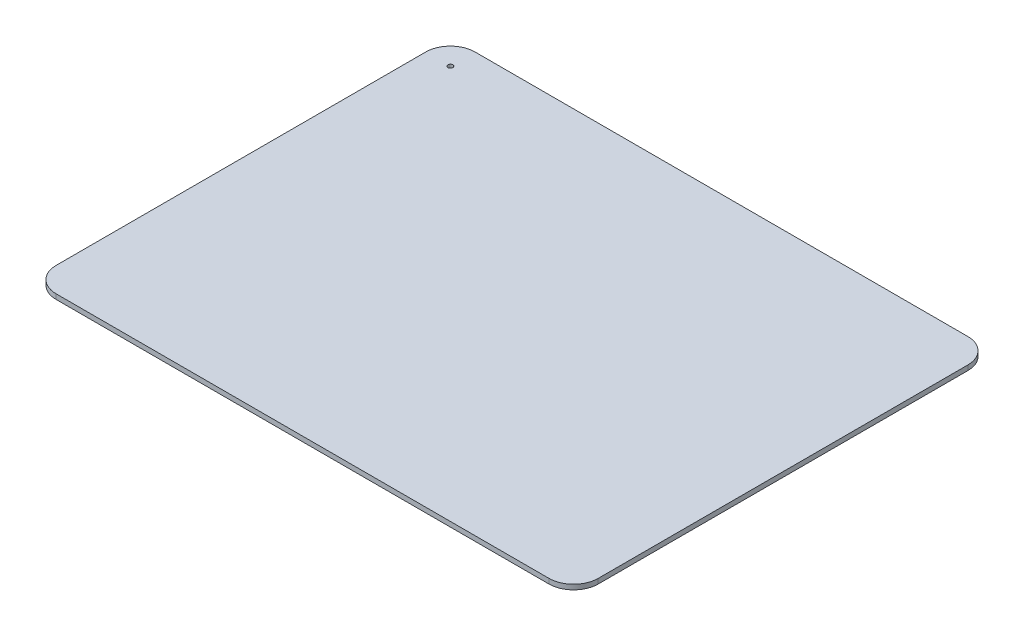
ISO-10303-21;
HEADER;
FILE_DESCRIPTION(('STEP AP214'),'2;1');
FILE_NAME('part.step','',(''),(''),'','','');
FILE_SCHEMA(('AUTOMOTIVE_DESIGN { 1 0 10303 214 1 1 1 1 }'));
ENDSEC;
DATA;
#1=APPLICATION_CONTEXT('core data for automotive mechanical design processes');
#2=APPLICATION_PROTOCOL_DEFINITION('international standard','automotive_design',2000,#1);
#3=PRODUCT_CONTEXT('',#1,'mechanical');
#4=PRODUCT('Part','Part','',(#3));
#5=PRODUCT_RELATED_PRODUCT_CATEGORY('part','',(#4));
#6=PRODUCT_DEFINITION_FORMATION('','',#4);
#7=PRODUCT_DEFINITION_CONTEXT('part definition',#1,'design');
#8=PRODUCT_DEFINITION('design','',#6,#7);
#9=PRODUCT_DEFINITION_SHAPE('','',#8);
#10=(LENGTH_UNIT() NAMED_UNIT(*) SI_UNIT(.MILLI.,.METRE.));
#11=(NAMED_UNIT(*) PLANE_ANGLE_UNIT() SI_UNIT($,.RADIAN.));
#12=(NAMED_UNIT(*) SI_UNIT($,.STERADIAN.) SOLID_ANGLE_UNIT());
#13=UNCERTAINTY_MEASURE_WITH_UNIT(LENGTH_MEASURE(1.E-05),#10,'distance_accuracy_value','');
#14=(GEOMETRIC_REPRESENTATION_CONTEXT(3) GLOBAL_UNCERTAINTY_ASSIGNED_CONTEXT((#13)) GLOBAL_UNIT_ASSIGNED_CONTEXT((#10,
#11,#12)) REPRESENTATION_CONTEXT('',''));
#15=CARTESIAN_POINT('',(0.,0.,0.));
#16=DIRECTION('',(0.,0.,1.));
#17=DIRECTION('',(1.,0.,0.));
#18=AXIS2_PLACEMENT_3D('',#15,#16,#17);
#19=CARTESIAN_POINT('',(500.,10.,375.));
#20=DIRECTION('',(0.,-1.,0.));
#21=DIRECTION('',(0.,0.,-1.));
#22=AXIS2_PLACEMENT_3D('',#19,#20,#21);
#23=CYLINDRICAL_SURFACE('',#22,50.);
#24=CARTESIAN_POINT('',(500.,0.,375.));
#25=DIRECTION('',(0.,1.,0.));
#26=DIRECTION('',(0.,0.,1.));
#27=AXIS2_PLACEMENT_3D('',#24,#25,#26);
#28=CIRCLE('',#27,50.);
#29=CARTESIAN_POINT('',(500.,0.,425.));
#30=VERTEX_POINT('',#29);
#31=CARTESIAN_POINT('',(550.,0.,375.));
#32=VERTEX_POINT('',#31);
#33=EDGE_CURVE('E134',#30,#32,#28,.T.);
#34=ORIENTED_EDGE('',*,*,#33,.T.);
#35=DIRECTION('',(0.,-1.,0.));
#36=VECTOR('',#35,1.);
#37=CARTESIAN_POINT('',(550.,10.,375.));
#38=LINE('',#37,#36);
#39=CARTESIAN_POINT('',(550.,10.,375.));
#40=VERTEX_POINT('',#39);
#41=EDGE_CURVE('E11',#40,#32,#38,.T.);
#42=ORIENTED_EDGE('',*,*,#41,.F.);
#43=CARTESIAN_POINT('',(500.,10.,375.));
#44=DIRECTION('',(0.,1.,0.));
#45=DIRECTION('',(0.,0.,1.));
#46=AXIS2_PLACEMENT_3D('',#43,#44,#45);
#47=CIRCLE('',#46,50.);
#48=CARTESIAN_POINT('',(500.,10.,425.));
#49=VERTEX_POINT('',#48);
#50=EDGE_CURVE('E148',#49,#40,#47,.T.);
#51=ORIENTED_EDGE('',*,*,#50,.F.);
#52=DIRECTION('',(0.,-1.,0.));
#53=VECTOR('',#52,1.);
#54=CARTESIAN_POINT('',(500.,10.,425.));
#55=LINE('',#54,#53);
#56=EDGE_CURVE('E130',#49,#30,#55,.T.);
#57=ORIENTED_EDGE('',*,*,#56,.T.);
#58=EDGE_LOOP('',(#34,#42,#51,#57));
#59=FACE_BOUND('',#58,.T.);
#60=ADVANCED_FACE('F37',(#59),#23,.T.);
#61=CARTESIAN_POINT('',(550.,10.,375.));
#62=DIRECTION('',(-1.,0.,0.));
#63=DIRECTION('',(0.,0.,1.));
#64=AXIS2_PLACEMENT_3D('',#61,#62,#63);
#65=PLANE('',#64);
#66=DIRECTION('',(0.,0.,-1.));
#67=VECTOR('',#66,1.);
#68=CARTESIAN_POINT('',(550.,0.,375.));
#69=LINE('',#68,#67);
#70=CARTESIAN_POINT('',(550.,0.,-375.));
#71=VERTEX_POINT('',#70);
#72=EDGE_CURVE('E137',#32,#71,#69,.T.);
#73=ORIENTED_EDGE('',*,*,#72,.T.);
#74=DIRECTION('',(0.,-1.,0.));
#75=VECTOR('',#74,1.);
#76=CARTESIAN_POINT('',(550.,10.,-375.));
#77=LINE('',#76,#75);
#78=CARTESIAN_POINT('',(550.,10.,-375.));
#79=VERTEX_POINT('',#78);
#80=EDGE_CURVE('E46',#79,#71,#77,.T.);
#81=ORIENTED_EDGE('',*,*,#80,.F.);
#82=DIRECTION('',(0.,0.,-1.));
#83=VECTOR('',#82,1.);
#84=CARTESIAN_POINT('',(550.,10.,375.));
#85=LINE('',#84,#83);
#86=EDGE_CURVE('E97',#40,#79,#85,.T.);
#87=ORIENTED_EDGE('',*,*,#86,.F.);
#88=ORIENTED_EDGE('',*,*,#41,.T.);
#89=EDGE_LOOP('',(#73,#81,#87,#88));
#90=FACE_BOUND('',#89,.T.);
#91=ADVANCED_FACE('F200',(#90),#65,.F.);
#92=CARTESIAN_POINT('',(500.,10.,-375.));
#93=DIRECTION('',(0.,-1.,0.));
#94=DIRECTION('',(0.,0.,-1.));
#95=AXIS2_PLACEMENT_3D('',#92,#93,#94);
#96=CYLINDRICAL_SURFACE('',#95,50.);
#97=CARTESIAN_POINT('',(500.,0.,-375.));
#98=DIRECTION('',(0.,1.,0.));
#99=DIRECTION('',(0.,0.,-1.));
#100=AXIS2_PLACEMENT_3D('',#97,#98,#99);
#101=CIRCLE('',#100,50.);
#102=CARTESIAN_POINT('',(500.,0.,-425.));
#103=VERTEX_POINT('',#102);
#104=EDGE_CURVE('E139',#71,#103,#101,.T.);
#105=ORIENTED_EDGE('',*,*,#104,.T.);
#106=DIRECTION('',(0.,-1.,0.));
#107=VECTOR('',#106,1.);
#108=CARTESIAN_POINT('',(500.,10.,-425.));
#109=LINE('',#108,#107);
#110=CARTESIAN_POINT('',(500.,10.,-425.));
#111=VERTEX_POINT('',#110);
#112=EDGE_CURVE('E155',#111,#103,#109,.T.);
#113=ORIENTED_EDGE('',*,*,#112,.F.);
#114=CARTESIAN_POINT('',(500.,10.,-375.));
#115=DIRECTION('',(0.,1.,0.));
#116=DIRECTION('',(0.,0.,-1.));
#117=AXIS2_PLACEMENT_3D('',#114,#115,#116);
#118=CIRCLE('',#117,50.);
#119=EDGE_CURVE('E164',#79,#111,#118,.T.);
#120=ORIENTED_EDGE('',*,*,#119,.F.);
#121=ORIENTED_EDGE('',*,*,#80,.T.);
#122=EDGE_LOOP('',(#105,#113,#120,#121));
#123=FACE_BOUND('',#122,.T.);
#124=ADVANCED_FACE('F162',(#123),#96,.T.);
#125=CARTESIAN_POINT('',(-500.,10.,-425.));
#126=DIRECTION('',(0.,0.,1.));
#127=DIRECTION('',(1.,0.,0.));
#128=AXIS2_PLACEMENT_3D('',#125,#126,#127);
#129=PLANE('',#128);
#130=DIRECTION('',(-1.,0.,0.));
#131=VECTOR('',#130,1.);
#132=CARTESIAN_POINT('',(-500.,0.,-425.));
#133=LINE('',#132,#131);
#134=CARTESIAN_POINT('',(-500.,0.,-425.));
#135=VERTEX_POINT('',#134);
#136=EDGE_CURVE('E141',#103,#135,#133,.T.);
#137=ORIENTED_EDGE('',*,*,#136,.T.);
#138=DIRECTION('',(0.,-1.,0.));
#139=VECTOR('',#138,1.);
#140=CARTESIAN_POINT('',(-500.,10.,-425.));
#141=LINE('',#140,#139);
#142=CARTESIAN_POINT('',(-500.,10.,-425.));
#143=VERTEX_POINT('',#142);
#144=EDGE_CURVE('E152',#143,#135,#141,.T.);
#145=ORIENTED_EDGE('',*,*,#144,.F.);
#146=DIRECTION('',(-1.,0.,0.));
#147=VECTOR('',#146,1.);
#148=CARTESIAN_POINT('',(-500.,10.,-425.));
#149=LINE('',#148,#147);
#150=EDGE_CURVE('E176',#111,#143,#149,.T.);
#151=ORIENTED_EDGE('',*,*,#150,.F.);
#152=ORIENTED_EDGE('',*,*,#112,.T.);
#153=EDGE_LOOP('',(#137,#145,#151,#152));
#154=FACE_BOUND('',#153,.T.);
#155=ADVANCED_FACE('F172',(#154),#129,.F.);
#156=CARTESIAN_POINT('',(-500.,10.,-375.));
#157=DIRECTION('',(0.,-1.,0.));
#158=DIRECTION('',(0.,0.,-1.));
#159=AXIS2_PLACEMENT_3D('',#156,#157,#158);
#160=CYLINDRICAL_SURFACE('',#159,50.);
#161=CARTESIAN_POINT('',(-500.,0.,-375.));
#162=DIRECTION('',(0.,1.,0.));
#163=DIRECTION('',(0.,0.,-1.));
#164=AXIS2_PLACEMENT_3D('',#161,#162,#163);
#165=CIRCLE('',#164,50.);
#166=CARTESIAN_POINT('',(-550.,0.,-375.));
#167=VERTEX_POINT('',#166);
#168=EDGE_CURVE('E143',#135,#167,#165,.T.);
#169=ORIENTED_EDGE('',*,*,#168,.T.);
#170=DIRECTION('',(0.,-1.,0.));
#171=VECTOR('',#170,1.);
#172=CARTESIAN_POINT('',(-550.,10.,-375.));
#173=LINE('',#172,#171);
#174=CARTESIAN_POINT('',(-550.,10.,-375.));
#175=VERTEX_POINT('',#174);
#176=EDGE_CURVE('E125',#175,#167,#173,.T.);
#177=ORIENTED_EDGE('',*,*,#176,.F.);
#178=CARTESIAN_POINT('',(-500.,10.,-375.));
#179=DIRECTION('',(0.,1.,0.));
#180=DIRECTION('',(0.,0.,-1.));
#181=AXIS2_PLACEMENT_3D('',#178,#179,#180);
#182=CIRCLE('',#181,50.);
#183=EDGE_CURVE('E116',#143,#175,#182,.T.);
#184=ORIENTED_EDGE('',*,*,#183,.F.);
#185=ORIENTED_EDGE('',*,*,#144,.T.);
#186=EDGE_LOOP('',(#169,#177,#184,#185));
#187=FACE_BOUND('',#186,.T.);
#188=ADVANCED_FACE('F175',(#187),#160,.T.);
#189=CARTESIAN_POINT('',(-550.,10.,375.));
#190=DIRECTION('',(1.,0.,0.));
#191=DIRECTION('',(0.,0.,-1.));
#192=AXIS2_PLACEMENT_3D('',#189,#190,#191);
#193=PLANE('',#192);
#194=DIRECTION('',(0.,0.,1.));
#195=VECTOR('',#194,1.);
#196=CARTESIAN_POINT('',(-550.,0.,375.));
#197=LINE('',#196,#195);
#198=CARTESIAN_POINT('',(-550.,0.,375.));
#199=VERTEX_POINT('',#198);
#200=EDGE_CURVE('E124',#167,#199,#197,.T.);
#201=ORIENTED_EDGE('',*,*,#200,.T.);
#202=DIRECTION('',(0.,-1.,0.));
#203=VECTOR('',#202,1.);
#204=CARTESIAN_POINT('',(-550.,10.,375.));
#205=LINE('',#204,#203);
#206=CARTESIAN_POINT('',(-550.,10.,375.));
#207=VERTEX_POINT('',#206);
#208=EDGE_CURVE('E121',#207,#199,#205,.T.);
#209=ORIENTED_EDGE('',*,*,#208,.F.);
#210=DIRECTION('',(0.,0.,1.));
#211=VECTOR('',#210,1.);
#212=CARTESIAN_POINT('',(-550.,10.,375.));
#213=LINE('',#212,#211);
#214=EDGE_CURVE('E110',#175,#207,#213,.T.);
#215=ORIENTED_EDGE('',*,*,#214,.F.);
#216=ORIENTED_EDGE('',*,*,#176,.T.);
#217=EDGE_LOOP('',(#201,#209,#215,#216));
#218=FACE_BOUND('',#217,.T.);
#219=ADVANCED_FACE('F122',(#218),#193,.F.);
#220=CARTESIAN_POINT('',(-500.,10.,375.));
#221=DIRECTION('',(0.,-1.,0.));
#222=DIRECTION('',(0.,0.,-1.));
#223=AXIS2_PLACEMENT_3D('',#220,#221,#222);
#224=CYLINDRICAL_SURFACE('',#223,50.0000000000001);
#225=CARTESIAN_POINT('',(-500.,0.,375.));
#226=DIRECTION('',(0.,1.,0.));
#227=DIRECTION('',(0.,0.,-1.));
#228=AXIS2_PLACEMENT_3D('',#225,#226,#227);
#229=CIRCLE('',#228,50.0000000000001);
#230=CARTESIAN_POINT('',(-500.,0.,425.));
#231=VERTEX_POINT('',#230);
#232=EDGE_CURVE('E83',#199,#231,#229,.T.);
#233=ORIENTED_EDGE('',*,*,#232,.T.);
#234=DIRECTION('',(0.,-1.,0.));
#235=VECTOR('',#234,1.);
#236=CARTESIAN_POINT('',(-500.,10.,425.));
#237=LINE('',#236,#235);
#238=CARTESIAN_POINT('',(-500.,10.,425.));
#239=VERTEX_POINT('',#238);
#240=EDGE_CURVE('E126',#239,#231,#237,.T.);
#241=ORIENTED_EDGE('',*,*,#240,.F.);
#242=CARTESIAN_POINT('',(-500.,10.,375.));
#243=DIRECTION('',(0.,1.,0.));
#244=DIRECTION('',(0.,0.,-1.));
#245=AXIS2_PLACEMENT_3D('',#242,#243,#244);
#246=CIRCLE('',#245,50.0000000000001);
#247=EDGE_CURVE('E114',#207,#239,#246,.T.);
#248=ORIENTED_EDGE('',*,*,#247,.F.);
#249=ORIENTED_EDGE('',*,*,#208,.T.);
#250=EDGE_LOOP('',(#233,#241,#248,#249));
#251=FACE_BOUND('',#250,.T.);
#252=ADVANCED_FACE('F128',(#251),#224,.T.);
#253=CARTESIAN_POINT('',(-500.,10.,425.));
#254=DIRECTION('',(0.,0.,-1.));
#255=DIRECTION('',(-1.,0.,0.));
#256=AXIS2_PLACEMENT_3D('',#253,#254,#255);
#257=PLANE('',#256);
#258=DIRECTION('',(1.,0.,0.));
#259=VECTOR('',#258,1.);
#260=CARTESIAN_POINT('',(-500.,0.,425.));
#261=LINE('',#260,#259);
#262=EDGE_CURVE('E89',#231,#30,#261,.T.);
#263=ORIENTED_EDGE('',*,*,#262,.T.);
#264=ORIENTED_EDGE('',*,*,#56,.F.);
#265=DIRECTION('',(1.,0.,0.));
#266=VECTOR('',#265,1.);
#267=CARTESIAN_POINT('',(-500.,10.,425.));
#268=LINE('',#267,#266);
#269=EDGE_CURVE('E54',#239,#49,#268,.T.);
#270=ORIENTED_EDGE('',*,*,#269,.F.);
#271=ORIENTED_EDGE('',*,*,#240,.T.);
#272=EDGE_LOOP('',(#263,#264,#270,#271));
#273=FACE_BOUND('',#272,.T.);
#274=ADVANCED_FACE('F207',(#273),#257,.F.);
#275=CARTESIAN_POINT('',(500.,10.,375.));
#276=DIRECTION('',(0.,1.,0.));
#277=DIRECTION('',(0.,0.,1.));
#278=AXIS2_PLACEMENT_3D('',#275,#276,#277);
#279=PLANE('',#278);
#280=CARTESIAN_POINT('',(-500.,10.,-375.));
#281=DIRECTION('',(0.,1.,0.));
#282=DIRECTION('',(0.,0.,1.));
#283=AXIS2_PLACEMENT_3D('',#280,#281,#282);
#284=CIRCLE('',#283,4.99999999999999);
#285=CARTESIAN_POINT('',(-500.,10.,-370.));
#286=VERTEX_POINT('',#285);
#287=EDGE_CURVE('E182',#286,#286,#284,.T.);
#288=ORIENTED_EDGE('',*,*,#287,.F.);
#289=EDGE_LOOP('',(#288));
#290=FACE_BOUND('',#289,.T.);
#291=ORIENTED_EDGE('',*,*,#50,.T.);
#292=ORIENTED_EDGE('',*,*,#86,.T.);
#293=ORIENTED_EDGE('',*,*,#119,.T.);
#294=ORIENTED_EDGE('',*,*,#150,.T.);
#295=ORIENTED_EDGE('',*,*,#183,.T.);
#296=ORIENTED_EDGE('',*,*,#214,.T.);
#297=ORIENTED_EDGE('',*,*,#247,.T.);
#298=ORIENTED_EDGE('',*,*,#269,.T.);
#299=EDGE_LOOP('',(#291,#292,#293,#294,#295,#296,#297,#298));
#300=FACE_BOUND('',#299,.T.);
#301=ADVANCED_FACE('F112',(#290,#300),#279,.T.);
#302=CARTESIAN_POINT('',(500.,0.,375.));
#303=DIRECTION('',(0.,1.,0.));
#304=DIRECTION('',(0.,0.,1.));
#305=AXIS2_PLACEMENT_3D('',#302,#303,#304);
#306=PLANE('',#305);
#307=CARTESIAN_POINT('',(-500.,0.,-375.));
#308=DIRECTION('',(0.,1.,0.));
#309=DIRECTION('',(0.,0.,1.));
#310=AXIS2_PLACEMENT_3D('',#307,#308,#309);
#311=CIRCLE('',#310,4.99999999999999);
#312=CARTESIAN_POINT('',(-500.,0.,-370.));
#313=VERTEX_POINT('',#312);
#314=EDGE_CURVE('E40',#313,#313,#311,.T.);
#315=ORIENTED_EDGE('',*,*,#314,.T.);
#316=EDGE_LOOP('',(#315));
#317=FACE_BOUND('',#316,.T.);
#318=ORIENTED_EDGE('',*,*,#33,.F.);
#319=ORIENTED_EDGE('',*,*,#262,.F.);
#320=ORIENTED_EDGE('',*,*,#232,.F.);
#321=ORIENTED_EDGE('',*,*,#200,.F.);
#322=ORIENTED_EDGE('',*,*,#168,.F.);
#323=ORIENTED_EDGE('',*,*,#136,.F.);
#324=ORIENTED_EDGE('',*,*,#104,.F.);
#325=ORIENTED_EDGE('',*,*,#72,.F.);
#326=EDGE_LOOP('',(#318,#319,#320,#321,#322,#323,#324,#325));
#327=FACE_BOUND('',#326,.T.);
#328=ADVANCED_FACE('F168',(#317,#327),#306,.F.);
#329=CARTESIAN_POINT('',(-500.,-40.,-375.));
#330=DIRECTION('',(0.,1.,0.));
#331=DIRECTION('',(0.,0.,1.));
#332=AXIS2_PLACEMENT_3D('',#329,#330,#331);
#333=CYLINDRICAL_SURFACE('',#332,4.99999999999999);
#334=ORIENTED_EDGE('',*,*,#287,.T.);
#335=EDGE_LOOP('',(#334));
#336=FACE_BOUND('',#335,.T.);
#337=ORIENTED_EDGE('',*,*,#314,.F.);
#338=EDGE_LOOP('',(#337));
#339=FACE_BOUND('',#338,.T.);
#340=ADVANCED_FACE('F190',(#336,#339),#333,.F.);
#341=CLOSED_SHELL('',(#60,#91,#124,#155,#188,#219,#252,#274,#301,#328,#340));
#342=MANIFOLD_SOLID_BREP('B2',#341);
#343=ADVANCED_BREP_SHAPE_REPRESENTATION('',(#18,#342),#14);
#344=SHAPE_DEFINITION_REPRESENTATION(#9,#343);
ENDSEC;
END-ISO-10303-21;
